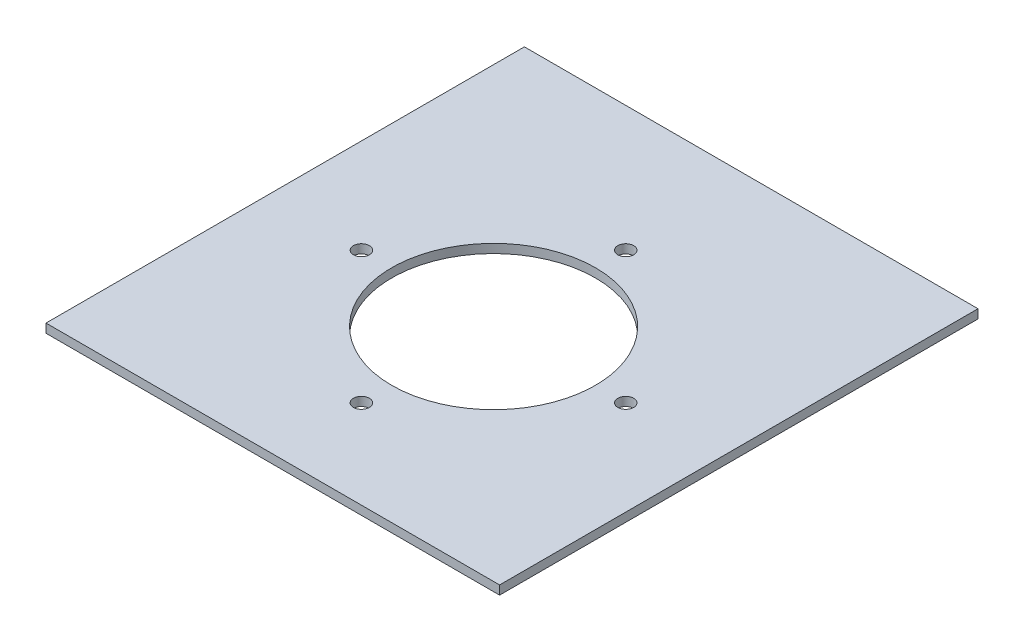
ISO-10303-21;
HEADER;
FILE_DESCRIPTION(('STEP AP214'),'2;1');
FILE_NAME('part.step','',(''),(''),'','','');
FILE_SCHEMA(('AUTOMOTIVE_DESIGN { 1 0 10303 214 1 1 1 1 }'));
ENDSEC;
DATA;
#1=APPLICATION_CONTEXT('core data for automotive mechanical design processes');
#2=APPLICATION_PROTOCOL_DEFINITION('international standard','automotive_design',2000,#1);
#3=PRODUCT_CONTEXT('',#1,'mechanical');
#4=PRODUCT('Part','Part','',(#3));
#5=PRODUCT_RELATED_PRODUCT_CATEGORY('part','',(#4));
#6=PRODUCT_DEFINITION_FORMATION('','',#4);
#7=PRODUCT_DEFINITION_CONTEXT('part definition',#1,'design');
#8=PRODUCT_DEFINITION('design','',#6,#7);
#9=PRODUCT_DEFINITION_SHAPE('','',#8);
#10=(LENGTH_UNIT() NAMED_UNIT(*) SI_UNIT(.MILLI.,.METRE.));
#11=(NAMED_UNIT(*) PLANE_ANGLE_UNIT() SI_UNIT($,.RADIAN.));
#12=(NAMED_UNIT(*) SI_UNIT($,.STERADIAN.) SOLID_ANGLE_UNIT());
#13=UNCERTAINTY_MEASURE_WITH_UNIT(LENGTH_MEASURE(1.E-05),#10,'distance_accuracy_value','');
#14=(GEOMETRIC_REPRESENTATION_CONTEXT(3) GLOBAL_UNCERTAINTY_ASSIGNED_CONTEXT((#13)) GLOBAL_UNIT_ASSIGNED_CONTEXT((#10,
#11,#12)) REPRESENTATION_CONTEXT('',''));
#15=CARTESIAN_POINT('',(0.,0.,0.));
#16=DIRECTION('',(0.,0.,1.));
#17=DIRECTION('',(1.,0.,0.));
#18=AXIS2_PLACEMENT_3D('',#15,#16,#17);
#19=CARTESIAN_POINT('',(0.,5.,0.));
#20=DIRECTION('',(1.,0.,0.));
#21=DIRECTION('',(0.,0.,-1.));
#22=AXIS2_PLACEMENT_3D('',#19,#20,#21);
#23=PLANE('',#22);
#24=DIRECTION('',(0.,0.,1.));
#25=VECTOR('',#24,1.);
#26=CARTESIAN_POINT('',(0.,0.,0.));
#27=LINE('',#26,#25);
#28=CARTESIAN_POINT('',(0.,0.,-270.));
#29=VERTEX_POINT('',#28);
#30=CARTESIAN_POINT('',(0.,0.,0.));
#31=VERTEX_POINT('',#30);
#32=EDGE_CURVE('E106',#29,#31,#27,.T.);
#33=ORIENTED_EDGE('',*,*,#32,.T.);
#34=DIRECTION('',(0.,-1.,0.));
#35=VECTOR('',#34,1.);
#36=CARTESIAN_POINT('',(0.,5.,0.));
#37=LINE('',#36,#35);
#38=CARTESIAN_POINT('',(0.,5.,0.));
#39=VERTEX_POINT('',#38);
#40=EDGE_CURVE('E11',#39,#31,#37,.T.);
#41=ORIENTED_EDGE('',*,*,#40,.F.);
#42=DIRECTION('',(0.,0.,1.));
#43=VECTOR('',#42,1.);
#44=CARTESIAN_POINT('',(0.,5.,0.));
#45=LINE('',#44,#43);
#46=CARTESIAN_POINT('',(0.,5.,-270.));
#47=VERTEX_POINT('',#46);
#48=EDGE_CURVE('E94',#47,#39,#45,.T.);
#49=ORIENTED_EDGE('',*,*,#48,.F.);
#50=DIRECTION('',(0.,-1.,0.));
#51=VECTOR('',#50,1.);
#52=CARTESIAN_POINT('',(0.,5.,-270.));
#53=LINE('',#52,#51);
#54=EDGE_CURVE('E102',#47,#29,#53,.T.);
#55=ORIENTED_EDGE('',*,*,#54,.T.);
#56=EDGE_LOOP('',(#33,#41,#49,#55));
#57=FACE_BOUND('',#56,.T.);
#58=ADVANCED_FACE('F43',(#57),#23,.F.);
#59=CARTESIAN_POINT('',(0.,5.,0.));
#60=DIRECTION('',(0.,0.,-1.));
#61=DIRECTION('',(-1.,0.,0.));
#62=AXIS2_PLACEMENT_3D('',#59,#60,#61);
#63=PLANE('',#62);
#64=DIRECTION('',(1.,0.,0.));
#65=VECTOR('',#64,1.);
#66=CARTESIAN_POINT('',(0.,0.,0.));
#67=LINE('',#66,#65);
#68=CARTESIAN_POINT('',(256.,0.,0.));
#69=VERTEX_POINT('',#68);
#70=EDGE_CURVE('E98',#31,#69,#67,.T.);
#71=ORIENTED_EDGE('',*,*,#70,.T.);
#72=DIRECTION('',(0.,-1.,0.));
#73=VECTOR('',#72,1.);
#74=CARTESIAN_POINT('',(256.,5.,0.));
#75=LINE('',#74,#73);
#76=CARTESIAN_POINT('',(256.,5.,0.));
#77=VERTEX_POINT('',#76);
#78=EDGE_CURVE('E51',#77,#69,#75,.T.);
#79=ORIENTED_EDGE('',*,*,#78,.F.);
#80=DIRECTION('',(1.,0.,0.));
#81=VECTOR('',#80,1.);
#82=CARTESIAN_POINT('',(0.,5.,0.));
#83=LINE('',#82,#81);
#84=EDGE_CURVE('E89',#39,#77,#83,.T.);
#85=ORIENTED_EDGE('',*,*,#84,.F.);
#86=ORIENTED_EDGE('',*,*,#40,.T.);
#87=EDGE_LOOP('',(#71,#79,#85,#86));
#88=FACE_BOUND('',#87,.T.);
#89=ADVANCED_FACE('F97',(#88),#63,.F.);
#90=CARTESIAN_POINT('',(256.,5.,0.));
#91=DIRECTION('',(-1.,0.,0.));
#92=DIRECTION('',(0.,0.,1.));
#93=AXIS2_PLACEMENT_3D('',#90,#91,#92);
#94=PLANE('',#93);
#95=DIRECTION('',(0.,0.,-1.));
#96=VECTOR('',#95,1.);
#97=CARTESIAN_POINT('',(256.,0.,0.));
#98=LINE('',#97,#96);
#99=CARTESIAN_POINT('',(256.,0.,-270.));
#100=VERTEX_POINT('',#99);
#101=EDGE_CURVE('E76',#69,#100,#98,.T.);
#102=ORIENTED_EDGE('',*,*,#101,.T.);
#103=DIRECTION('',(0.,-1.,0.));
#104=VECTOR('',#103,1.);
#105=CARTESIAN_POINT('',(256.,5.,-270.));
#106=LINE('',#105,#104);
#107=CARTESIAN_POINT('',(256.,5.,-270.));
#108=VERTEX_POINT('',#107);
#109=EDGE_CURVE('E99',#108,#100,#106,.T.);
#110=ORIENTED_EDGE('',*,*,#109,.F.);
#111=DIRECTION('',(0.,0.,-1.));
#112=VECTOR('',#111,1.);
#113=CARTESIAN_POINT('',(256.,5.,0.));
#114=LINE('',#113,#112);
#115=EDGE_CURVE('E92',#77,#108,#114,.T.);
#116=ORIENTED_EDGE('',*,*,#115,.F.);
#117=ORIENTED_EDGE('',*,*,#78,.T.);
#118=EDGE_LOOP('',(#102,#110,#116,#117));
#119=FACE_BOUND('',#118,.T.);
#120=ADVANCED_FACE('F100',(#119),#94,.F.);
#121=CARTESIAN_POINT('',(0.,5.,-270.));
#122=DIRECTION('',(0.,0.,1.));
#123=DIRECTION('',(1.,0.,0.));
#124=AXIS2_PLACEMENT_3D('',#121,#122,#123);
#125=PLANE('',#124);
#126=DIRECTION('',(-1.,0.,0.));
#127=VECTOR('',#126,1.);
#128=CARTESIAN_POINT('',(0.,0.,-270.));
#129=LINE('',#128,#127);
#130=EDGE_CURVE('E82',#100,#29,#129,.T.);
#131=ORIENTED_EDGE('',*,*,#130,.T.);
#132=ORIENTED_EDGE('',*,*,#54,.F.);
#133=DIRECTION('',(-1.,0.,0.));
#134=VECTOR('',#133,1.);
#135=CARTESIAN_POINT('',(0.,5.,-270.));
#136=LINE('',#135,#134);
#137=EDGE_CURVE('E59',#108,#47,#136,.T.);
#138=ORIENTED_EDGE('',*,*,#137,.F.);
#139=ORIENTED_EDGE('',*,*,#109,.T.);
#140=EDGE_LOOP('',(#131,#132,#138,#139));
#141=FACE_BOUND('',#140,.T.);
#142=ADVANCED_FACE('F114',(#141),#125,.F.);
#143=CARTESIAN_POINT('',(0.,5.,0.));
#144=DIRECTION('',(0.,-1.,0.));
#145=DIRECTION('',(0.,0.,-1.));
#146=AXIS2_PLACEMENT_3D('',#143,#144,#145);
#147=PLANE('',#146);
#148=CARTESIAN_POINT('',(128.,5.,-199.2));
#149=DIRECTION('',(0.,1.,0.));
#150=DIRECTION('',(0.,0.,1.));
#151=AXIS2_PLACEMENT_3D('',#148,#149,#150);
#152=CIRCLE('',#151,4.5);
#153=CARTESIAN_POINT('',(128.,5.,-194.7));
#154=VERTEX_POINT('',#153);
#155=EDGE_CURVE('E133',#154,#154,#152,.T.);
#156=ORIENTED_EDGE('',*,*,#155,.F.);
#157=EDGE_LOOP('',(#156));
#158=FACE_BOUND('',#157,.T.);
#159=CARTESIAN_POINT('',(53.4,5.,-124.6));
#160=DIRECTION('',(0.,1.,0.));
#161=DIRECTION('',(0.,0.,1.));
#162=AXIS2_PLACEMENT_3D('',#159,#160,#161);
#163=CIRCLE('',#162,4.49999999999999);
#164=CARTESIAN_POINT('',(53.4,5.,-120.1));
#165=VERTEX_POINT('',#164);
#166=EDGE_CURVE('E134',#165,#165,#163,.T.);
#167=ORIENTED_EDGE('',*,*,#166,.F.);
#168=EDGE_LOOP('',(#167));
#169=FACE_BOUND('',#168,.T.);
#170=CARTESIAN_POINT('',(128.,5.,-50.));
#171=DIRECTION('',(0.,1.,0.));
#172=DIRECTION('',(0.,0.,1.));
#173=AXIS2_PLACEMENT_3D('',#170,#171,#172);
#174=CIRCLE('',#173,4.49999999999999);
#175=CARTESIAN_POINT('',(128.,5.,-45.5));
#176=VERTEX_POINT('',#175);
#177=EDGE_CURVE('E140',#176,#176,#174,.T.);
#178=ORIENTED_EDGE('',*,*,#177,.F.);
#179=EDGE_LOOP('',(#178));
#180=FACE_BOUND('',#179,.T.);
#181=CARTESIAN_POINT('',(202.6,5.,-124.6));
#182=DIRECTION('',(0.,1.,0.));
#183=DIRECTION('',(0.,0.,1.));
#184=AXIS2_PLACEMENT_3D('',#181,#182,#183);
#185=CIRCLE('',#184,4.49999999999999);
#186=CARTESIAN_POINT('',(202.6,5.,-120.1));
#187=VERTEX_POINT('',#186);
#188=EDGE_CURVE('E120',#187,#187,#185,.T.);
#189=ORIENTED_EDGE('',*,*,#188,.F.);
#190=EDGE_LOOP('',(#189));
#191=FACE_BOUND('',#190,.T.);
#192=CARTESIAN_POINT('',(128.,5.,-124.6));
#193=DIRECTION('',(0.,1.,0.));
#194=DIRECTION('',(0.,0.,1.));
#195=AXIS2_PLACEMENT_3D('',#192,#193,#194);
#196=CIRCLE('',#195,57.5);
#197=CARTESIAN_POINT('',(128.,5.,-67.1));
#198=VERTEX_POINT('',#197);
#199=EDGE_CURVE('E127',#198,#198,#196,.T.);
#200=ORIENTED_EDGE('',*,*,#199,.F.);
#201=EDGE_LOOP('',(#200));
#202=FACE_BOUND('',#201,.T.);
#203=ORIENTED_EDGE('',*,*,#48,.T.);
#204=ORIENTED_EDGE('',*,*,#84,.T.);
#205=ORIENTED_EDGE('',*,*,#115,.T.);
#206=ORIENTED_EDGE('',*,*,#137,.T.);
#207=EDGE_LOOP('',(#203,#204,#205,#206));
#208=FACE_BOUND('',#207,.T.);
#209=ADVANCED_FACE('F90',(#158,#169,#180,#191,#202,#208),#147,.F.);
#210=CARTESIAN_POINT('',(0.,0.,0.));
#211=DIRECTION('',(0.,-1.,0.));
#212=DIRECTION('',(0.,0.,-1.));
#213=AXIS2_PLACEMENT_3D('',#210,#211,#212);
#214=PLANE('',#213);
#215=CARTESIAN_POINT('',(128.,0.,-199.2));
#216=DIRECTION('',(0.,1.,0.));
#217=DIRECTION('',(0.,0.,1.));
#218=AXIS2_PLACEMENT_3D('',#215,#216,#217);
#219=CIRCLE('',#218,4.5);
#220=CARTESIAN_POINT('',(128.,0.,-194.7));
#221=VERTEX_POINT('',#220);
#222=EDGE_CURVE('E109',#221,#221,#219,.T.);
#223=ORIENTED_EDGE('',*,*,#222,.T.);
#224=EDGE_LOOP('',(#223));
#225=FACE_BOUND('',#224,.T.);
#226=CARTESIAN_POINT('',(53.4,0.,-124.6));
#227=DIRECTION('',(0.,1.,0.));
#228=DIRECTION('',(0.,0.,1.));
#229=AXIS2_PLACEMENT_3D('',#226,#227,#228);
#230=CIRCLE('',#229,4.49999999999999);
#231=CARTESIAN_POINT('',(53.4,0.,-120.1));
#232=VERTEX_POINT('',#231);
#233=EDGE_CURVE('E137',#232,#232,#230,.T.);
#234=ORIENTED_EDGE('',*,*,#233,.T.);
#235=EDGE_LOOP('',(#234));
#236=FACE_BOUND('',#235,.T.);
#237=CARTESIAN_POINT('',(128.,0.,-50.));
#238=DIRECTION('',(0.,1.,0.));
#239=DIRECTION('',(0.,0.,1.));
#240=AXIS2_PLACEMENT_3D('',#237,#238,#239);
#241=CIRCLE('',#240,4.49999999999999);
#242=CARTESIAN_POINT('',(128.,0.,-45.5));
#243=VERTEX_POINT('',#242);
#244=EDGE_CURVE('E124',#243,#243,#241,.T.);
#245=ORIENTED_EDGE('',*,*,#244,.T.);
#246=EDGE_LOOP('',(#245));
#247=FACE_BOUND('',#246,.T.);
#248=CARTESIAN_POINT('',(202.6,0.,-124.6));
#249=DIRECTION('',(0.,1.,0.));
#250=DIRECTION('',(0.,0.,1.));
#251=AXIS2_PLACEMENT_3D('',#248,#249,#250);
#252=CIRCLE('',#251,4.49999999999999);
#253=CARTESIAN_POINT('',(202.6,0.,-120.1));
#254=VERTEX_POINT('',#253);
#255=EDGE_CURVE('E123',#254,#254,#252,.T.);
#256=ORIENTED_EDGE('',*,*,#255,.T.);
#257=EDGE_LOOP('',(#256));
#258=FACE_BOUND('',#257,.T.);
#259=CARTESIAN_POINT('',(128.,0.,-124.6));
#260=DIRECTION('',(0.,1.,0.));
#261=DIRECTION('',(0.,0.,1.));
#262=AXIS2_PLACEMENT_3D('',#259,#260,#261);
#263=CIRCLE('',#262,57.5);
#264=CARTESIAN_POINT('',(128.,0.,-67.1));
#265=VERTEX_POINT('',#264);
#266=EDGE_CURVE('E130',#265,#265,#263,.T.);
#267=ORIENTED_EDGE('',*,*,#266,.T.);
#268=EDGE_LOOP('',(#267));
#269=FACE_BOUND('',#268,.T.);
#270=ORIENTED_EDGE('',*,*,#32,.F.);
#271=ORIENTED_EDGE('',*,*,#130,.F.);
#272=ORIENTED_EDGE('',*,*,#101,.F.);
#273=ORIENTED_EDGE('',*,*,#70,.F.);
#274=EDGE_LOOP('',(#270,#271,#272,#273));
#275=FACE_BOUND('',#274,.T.);
#276=ADVANCED_FACE('F117',(#225,#236,#247,#258,#269,#275),#214,.T.);
#277=CARTESIAN_POINT('',(128.,0.,-124.6));
#278=DIRECTION('',(0.,1.,0.));
#279=DIRECTION('',(0.,0.,1.));
#280=AXIS2_PLACEMENT_3D('',#277,#278,#279);
#281=CYLINDRICAL_SURFACE('',#280,57.5);
#282=ORIENTED_EDGE('',*,*,#266,.F.);
#283=EDGE_LOOP('',(#282));
#284=FACE_BOUND('',#283,.T.);
#285=ORIENTED_EDGE('',*,*,#199,.T.);
#286=EDGE_LOOP('',(#285));
#287=FACE_BOUND('',#286,.T.);
#288=ADVANCED_FACE('F170',(#284,#287),#281,.F.);
#289=CARTESIAN_POINT('',(202.6,0.,-124.6));
#290=DIRECTION('',(0.,1.,0.));
#291=DIRECTION('',(0.,0.,1.));
#292=AXIS2_PLACEMENT_3D('',#289,#290,#291);
#293=CYLINDRICAL_SURFACE('',#292,4.49999999999999);
#294=ORIENTED_EDGE('',*,*,#255,.F.);
#295=EDGE_LOOP('',(#294));
#296=FACE_BOUND('',#295,.T.);
#297=ORIENTED_EDGE('',*,*,#188,.T.);
#298=EDGE_LOOP('',(#297));
#299=FACE_BOUND('',#298,.T.);
#300=ADVANCED_FACE('F172',(#296,#299),#293,.F.);
#301=CARTESIAN_POINT('',(128.,0.,-50.));
#302=DIRECTION('',(0.,1.,0.));
#303=DIRECTION('',(0.,0.,1.));
#304=AXIS2_PLACEMENT_3D('',#301,#302,#303);
#305=CYLINDRICAL_SURFACE('',#304,4.49999999999999);
#306=ORIENTED_EDGE('',*,*,#244,.F.);
#307=EDGE_LOOP('',(#306));
#308=FACE_BOUND('',#307,.T.);
#309=ORIENTED_EDGE('',*,*,#177,.T.);
#310=EDGE_LOOP('',(#309));
#311=FACE_BOUND('',#310,.T.);
#312=ADVANCED_FACE('F179',(#308,#311),#305,.F.);
#313=CARTESIAN_POINT('',(53.4,0.,-124.6));
#314=DIRECTION('',(0.,1.,0.));
#315=DIRECTION('',(0.,0.,1.));
#316=AXIS2_PLACEMENT_3D('',#313,#314,#315);
#317=CYLINDRICAL_SURFACE('',#316,4.49999999999999);
#318=ORIENTED_EDGE('',*,*,#233,.F.);
#319=EDGE_LOOP('',(#318));
#320=FACE_BOUND('',#319,.T.);
#321=ORIENTED_EDGE('',*,*,#166,.T.);
#322=EDGE_LOOP('',(#321));
#323=FACE_BOUND('',#322,.T.);
#324=ADVANCED_FACE('F155',(#320,#323),#317,.F.);
#325=CARTESIAN_POINT('',(128.,0.,-199.2));
#326=DIRECTION('',(0.,1.,0.));
#327=DIRECTION('',(0.,0.,1.));
#328=AXIS2_PLACEMENT_3D('',#325,#326,#327);
#329=CYLINDRICAL_SURFACE('',#328,4.5);
#330=ORIENTED_EDGE('',*,*,#222,.F.);
#331=EDGE_LOOP('',(#330));
#332=FACE_BOUND('',#331,.T.);
#333=ORIENTED_EDGE('',*,*,#155,.T.);
#334=EDGE_LOOP('',(#333));
#335=FACE_BOUND('',#334,.T.);
#336=ADVANCED_FACE('F152',(#332,#335),#329,.F.);
#337=CLOSED_SHELL('',(#58,#89,#120,#142,#209,#276,#288,#300,#312,#324,#336));
#338=MANIFOLD_SOLID_BREP('B2',#337);
#339=ADVANCED_BREP_SHAPE_REPRESENTATION('',(#18,#338),#14);
#340=SHAPE_DEFINITION_REPRESENTATION(#9,#339);
ENDSEC;
END-ISO-10303-21;
